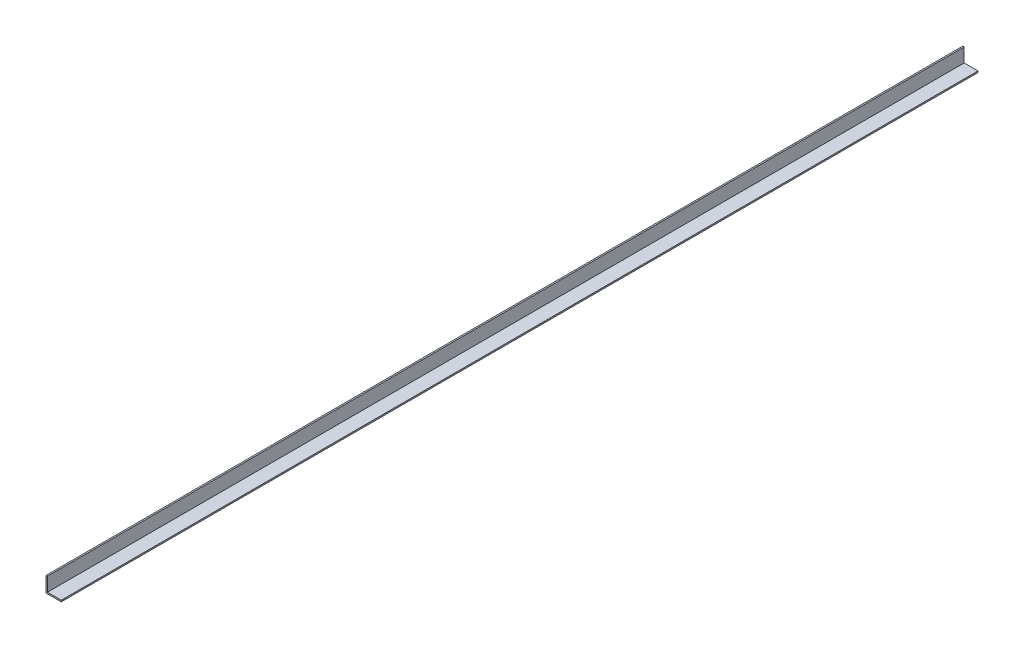
ISO-10303-21;
HEADER;
FILE_DESCRIPTION(('STEP AP214'),'2;1');
FILE_NAME('part.step','',(''),(''),'','','');
FILE_SCHEMA(('AUTOMOTIVE_DESIGN { 1 0 10303 214 1 1 1 1 }'));
ENDSEC;
DATA;
#1=APPLICATION_CONTEXT('core data for automotive mechanical design processes');
#2=APPLICATION_PROTOCOL_DEFINITION('international standard','automotive_design',2000,#1);
#3=PRODUCT_CONTEXT('',#1,'mechanical');
#4=PRODUCT('Part','Part','',(#3));
#5=PRODUCT_RELATED_PRODUCT_CATEGORY('part','',(#4));
#6=PRODUCT_DEFINITION_FORMATION('','',#4);
#7=PRODUCT_DEFINITION_CONTEXT('part definition',#1,'design');
#8=PRODUCT_DEFINITION('design','',#6,#7);
#9=PRODUCT_DEFINITION_SHAPE('','',#8);
#10=(LENGTH_UNIT() NAMED_UNIT(*) SI_UNIT(.MILLI.,.METRE.));
#11=(NAMED_UNIT(*) PLANE_ANGLE_UNIT() SI_UNIT($,.RADIAN.));
#12=(NAMED_UNIT(*) SI_UNIT($,.STERADIAN.) SOLID_ANGLE_UNIT());
#13=UNCERTAINTY_MEASURE_WITH_UNIT(LENGTH_MEASURE(1.E-05),#10,'distance_accuracy_value','');
#14=(GEOMETRIC_REPRESENTATION_CONTEXT(3) GLOBAL_UNCERTAINTY_ASSIGNED_CONTEXT((#13)) GLOBAL_UNIT_ASSIGNED_CONTEXT((#10,
#11,#12)) REPRESENTATION_CONTEXT('',''));
#15=CARTESIAN_POINT('',(0.,0.,0.));
#16=DIRECTION('',(0.,0.,1.));
#17=DIRECTION('',(1.,0.,0.));
#18=AXIS2_PLACEMENT_3D('',#15,#16,#17);
#19=CARTESIAN_POINT('',(9.53,101.6,-6100.));
#20=DIRECTION('',(0.,1.,0.));
#21=DIRECTION('',(0.,0.,1.));
#22=AXIS2_PLACEMENT_3D('',#19,#20,#21);
#23=PLANE('',#22);
#24=DIRECTION('',(-1.,0.,0.));
#25=VECTOR('',#24,1.);
#26=CARTESIAN_POINT('',(9.53,101.6,0.));
#27=LINE('',#26,#25);
#28=CARTESIAN_POINT('',(9.53,101.6,0.));
#29=VERTEX_POINT('',#28);
#30=CARTESIAN_POINT('',(0.,101.6,0.));
#31=VERTEX_POINT('',#30);
#32=EDGE_CURVE('E118',#29,#31,#27,.T.);
#33=ORIENTED_EDGE('',*,*,#32,.F.);
#34=DIRECTION('',(0.,0.,1.));
#35=VECTOR('',#34,1.);
#36=CARTESIAN_POINT('',(9.53,101.6,-6100.));
#37=LINE('',#36,#35);
#38=CARTESIAN_POINT('',(9.53,101.6,-6100.));
#39=VERTEX_POINT('',#38);
#40=EDGE_CURVE('E11',#39,#29,#37,.T.);
#41=ORIENTED_EDGE('',*,*,#40,.F.);
#42=DIRECTION('',(-1.,0.,0.));
#43=VECTOR('',#42,1.);
#44=CARTESIAN_POINT('',(9.53,101.6,-6100.));
#45=LINE('',#44,#43);
#46=CARTESIAN_POINT('',(0.,101.6,-6100.));
#47=VERTEX_POINT('',#46);
#48=EDGE_CURVE('E132',#39,#47,#45,.T.);
#49=ORIENTED_EDGE('',*,*,#48,.T.);
#50=DIRECTION('',(0.,0.,1.));
#51=VECTOR('',#50,1.);
#52=CARTESIAN_POINT('',(0.,101.6,-6100.));
#53=LINE('',#52,#51);
#54=EDGE_CURVE('E36',#47,#31,#53,.T.);
#55=ORIENTED_EDGE('',*,*,#54,.T.);
#56=EDGE_LOOP('',(#33,#41,#49,#55));
#57=FACE_BOUND('',#56,.T.);
#58=ADVANCED_FACE('F33',(#57),#23,.T.);
#59=CARTESIAN_POINT('',(9.53,9.52999999999999,-6100.));
#60=DIRECTION('',(1.,0.,0.));
#61=DIRECTION('',(0.,1.,0.));
#62=AXIS2_PLACEMENT_3D('',#59,#60,#61);
#63=PLANE('',#62);
#64=DIRECTION('',(0.,1.,0.));
#65=VECTOR('',#64,1.);
#66=CARTESIAN_POINT('',(9.53,9.52999999999999,0.));
#67=LINE('',#66,#65);
#68=CARTESIAN_POINT('',(9.53,9.52999999999999,0.));
#69=VERTEX_POINT('',#68);
#70=EDGE_CURVE('E130',#69,#29,#67,.T.);
#71=ORIENTED_EDGE('',*,*,#70,.F.);
#72=DIRECTION('',(0.,0.,1.));
#73=VECTOR('',#72,1.);
#74=CARTESIAN_POINT('',(9.53,9.52999999999999,-6100.));
#75=LINE('',#74,#73);
#76=CARTESIAN_POINT('',(9.53,9.52999999999999,-6100.));
#77=VERTEX_POINT('',#76);
#78=EDGE_CURVE('E42',#77,#69,#75,.T.);
#79=ORIENTED_EDGE('',*,*,#78,.F.);
#80=DIRECTION('',(0.,1.,0.));
#81=VECTOR('',#80,1.);
#82=CARTESIAN_POINT('',(9.53,9.52999999999999,-6100.));
#83=LINE('',#82,#81);
#84=EDGE_CURVE('E108',#77,#39,#83,.T.);
#85=ORIENTED_EDGE('',*,*,#84,.T.);
#86=ORIENTED_EDGE('',*,*,#40,.T.);
#87=EDGE_LOOP('',(#71,#79,#85,#86));
#88=FACE_BOUND('',#87,.T.);
#89=ADVANCED_FACE('F140',(#88),#63,.T.);
#90=CARTESIAN_POINT('',(101.6,9.53,-6100.));
#91=DIRECTION('',(0.,1.,0.));
#92=DIRECTION('',(-1.,0.,0.));
#93=AXIS2_PLACEMENT_3D('',#90,#91,#92);
#94=PLANE('',#93);
#95=DIRECTION('',(-1.,0.,0.));
#96=VECTOR('',#95,1.);
#97=CARTESIAN_POINT('',(101.6,9.53,0.));
#98=LINE('',#97,#96);
#99=CARTESIAN_POINT('',(101.6,9.53,0.));
#100=VERTEX_POINT('',#99);
#101=EDGE_CURVE('E95',#100,#69,#98,.T.);
#102=ORIENTED_EDGE('',*,*,#101,.F.);
#103=DIRECTION('',(0.,0.,1.));
#104=VECTOR('',#103,1.);
#105=CARTESIAN_POINT('',(101.6,9.53,-6100.));
#106=LINE('',#105,#104);
#107=CARTESIAN_POINT('',(101.6,9.53,-6100.));
#108=VERTEX_POINT('',#107);
#109=EDGE_CURVE('E90',#108,#100,#106,.T.);
#110=ORIENTED_EDGE('',*,*,#109,.F.);
#111=DIRECTION('',(-1.,0.,0.));
#112=VECTOR('',#111,1.);
#113=CARTESIAN_POINT('',(101.6,9.53,-6100.));
#114=LINE('',#113,#112);
#115=EDGE_CURVE('E93',#108,#77,#114,.T.);
#116=ORIENTED_EDGE('',*,*,#115,.T.);
#117=ORIENTED_EDGE('',*,*,#78,.T.);
#118=EDGE_LOOP('',(#102,#110,#116,#117));
#119=FACE_BOUND('',#118,.T.);
#120=ADVANCED_FACE('F92',(#119),#94,.T.);
#121=CARTESIAN_POINT('',(101.6,0.,-6100.));
#122=DIRECTION('',(1.,0.,0.));
#123=DIRECTION('',(0.,0.,-1.));
#124=AXIS2_PLACEMENT_3D('',#121,#122,#123);
#125=PLANE('',#124);
#126=DIRECTION('',(0.,1.,0.));
#127=VECTOR('',#126,1.);
#128=CARTESIAN_POINT('',(101.6,0.,0.));
#129=LINE('',#128,#127);
#130=CARTESIAN_POINT('',(101.6,0.,0.));
#131=VERTEX_POINT('',#130);
#132=EDGE_CURVE('E127',#131,#100,#129,.T.);
#133=ORIENTED_EDGE('',*,*,#132,.F.);
#134=DIRECTION('',(0.,0.,1.));
#135=VECTOR('',#134,1.);
#136=CARTESIAN_POINT('',(101.6,0.,-6100.));
#137=LINE('',#136,#135);
#138=CARTESIAN_POINT('',(101.6,0.,-6100.));
#139=VERTEX_POINT('',#138);
#140=EDGE_CURVE('E100',#139,#131,#137,.T.);
#141=ORIENTED_EDGE('',*,*,#140,.F.);
#142=DIRECTION('',(0.,1.,0.));
#143=VECTOR('',#142,1.);
#144=CARTESIAN_POINT('',(101.6,0.,-6100.));
#145=LINE('',#144,#143);
#146=EDGE_CURVE('E106',#139,#108,#145,.T.);
#147=ORIENTED_EDGE('',*,*,#146,.T.);
#148=ORIENTED_EDGE('',*,*,#109,.T.);
#149=EDGE_LOOP('',(#133,#141,#147,#148));
#150=FACE_BOUND('',#149,.T.);
#151=ADVANCED_FACE('F110',(#150),#125,.T.);
#152=CARTESIAN_POINT('',(0.,0.,-6100.));
#153=DIRECTION('',(0.,-1.,0.));
#154=DIRECTION('',(0.,0.,-1.));
#155=AXIS2_PLACEMENT_3D('',#152,#153,#154);
#156=PLANE('',#155);
#157=DIRECTION('',(1.,0.,0.));
#158=VECTOR('',#157,1.);
#159=CARTESIAN_POINT('',(0.,0.,0.));
#160=LINE('',#159,#158);
#161=CARTESIAN_POINT('',(0.,0.,0.));
#162=VERTEX_POINT('',#161);
#163=EDGE_CURVE('E124',#162,#131,#160,.T.);
#164=ORIENTED_EDGE('',*,*,#163,.F.);
#165=DIRECTION('',(0.,0.,1.));
#166=VECTOR('',#165,1.);
#167=CARTESIAN_POINT('',(0.,0.,-6100.));
#168=LINE('',#167,#166);
#169=CARTESIAN_POINT('',(0.,0.,-6100.));
#170=VERTEX_POINT('',#169);
#171=EDGE_CURVE('E135',#170,#162,#168,.T.);
#172=ORIENTED_EDGE('',*,*,#171,.F.);
#173=DIRECTION('',(1.,0.,0.));
#174=VECTOR('',#173,1.);
#175=CARTESIAN_POINT('',(0.,0.,-6100.));
#176=LINE('',#175,#174);
#177=EDGE_CURVE('E111',#170,#139,#176,.T.);
#178=ORIENTED_EDGE('',*,*,#177,.T.);
#179=ORIENTED_EDGE('',*,*,#140,.T.);
#180=EDGE_LOOP('',(#164,#172,#178,#179));
#181=FACE_BOUND('',#180,.T.);
#182=ADVANCED_FACE('F153',(#181),#156,.T.);
#183=CARTESIAN_POINT('',(0.,101.6,-6100.));
#184=DIRECTION('',(-1.,0.,0.));
#185=DIRECTION('',(0.,-1.,0.));
#186=AXIS2_PLACEMENT_3D('',#183,#184,#185);
#187=PLANE('',#186);
#188=DIRECTION('',(0.,-1.,0.));
#189=VECTOR('',#188,1.);
#190=CARTESIAN_POINT('',(0.,101.6,0.));
#191=LINE('',#190,#189);
#192=EDGE_CURVE('E121',#31,#162,#191,.T.);
#193=ORIENTED_EDGE('',*,*,#192,.F.);
#194=ORIENTED_EDGE('',*,*,#54,.F.);
#195=DIRECTION('',(0.,-1.,0.));
#196=VECTOR('',#195,1.);
#197=CARTESIAN_POINT('',(0.,101.6,-6100.));
#198=LINE('',#197,#196);
#199=EDGE_CURVE('E113',#47,#170,#198,.T.);
#200=ORIENTED_EDGE('',*,*,#199,.T.);
#201=ORIENTED_EDGE('',*,*,#171,.T.);
#202=EDGE_LOOP('',(#193,#194,#200,#201));
#203=FACE_BOUND('',#202,.T.);
#204=ADVANCED_FACE('F137',(#203),#187,.T.);
#205=CARTESIAN_POINT('',(0.,0.,-6100.));
#206=DIRECTION('',(0.,0.,1.));
#207=DIRECTION('',(1.,0.,0.));
#208=AXIS2_PLACEMENT_3D('',#205,#206,#207);
#209=PLANE('',#208);
#210=ORIENTED_EDGE('',*,*,#48,.F.);
#211=ORIENTED_EDGE('',*,*,#84,.F.);
#212=ORIENTED_EDGE('',*,*,#115,.F.);
#213=ORIENTED_EDGE('',*,*,#146,.F.);
#214=ORIENTED_EDGE('',*,*,#177,.F.);
#215=ORIENTED_EDGE('',*,*,#199,.F.);
#216=EDGE_LOOP('',(#210,#211,#212,#213,#214,#215));
#217=FACE_BOUND('',#216,.T.);
#218=ADVANCED_FACE('F104',(#217),#209,.F.);
#219=CARTESIAN_POINT('',(0.,0.,0.));
#220=DIRECTION('',(0.,0.,1.));
#221=DIRECTION('',(1.,0.,0.));
#222=AXIS2_PLACEMENT_3D('',#219,#220,#221);
#223=PLANE('',#222);
#224=ORIENTED_EDGE('',*,*,#32,.T.);
#225=ORIENTED_EDGE('',*,*,#192,.T.);
#226=ORIENTED_EDGE('',*,*,#163,.T.);
#227=ORIENTED_EDGE('',*,*,#132,.T.);
#228=ORIENTED_EDGE('',*,*,#101,.T.);
#229=ORIENTED_EDGE('',*,*,#70,.T.);
#230=EDGE_LOOP('',(#224,#225,#226,#227,#228,#229));
#231=FACE_BOUND('',#230,.T.);
#232=ADVANCED_FACE('F139',(#231),#223,.T.);
#233=CLOSED_SHELL('',(#58,#89,#120,#151,#182,#204,#218,#232));
#234=MANIFOLD_SOLID_BREP('B2',#233);
#235=ADVANCED_BREP_SHAPE_REPRESENTATION('',(#18,#234),#14);
#236=SHAPE_DEFINITION_REPRESENTATION(#9,#235);
ENDSEC;
END-ISO-10303-21;
